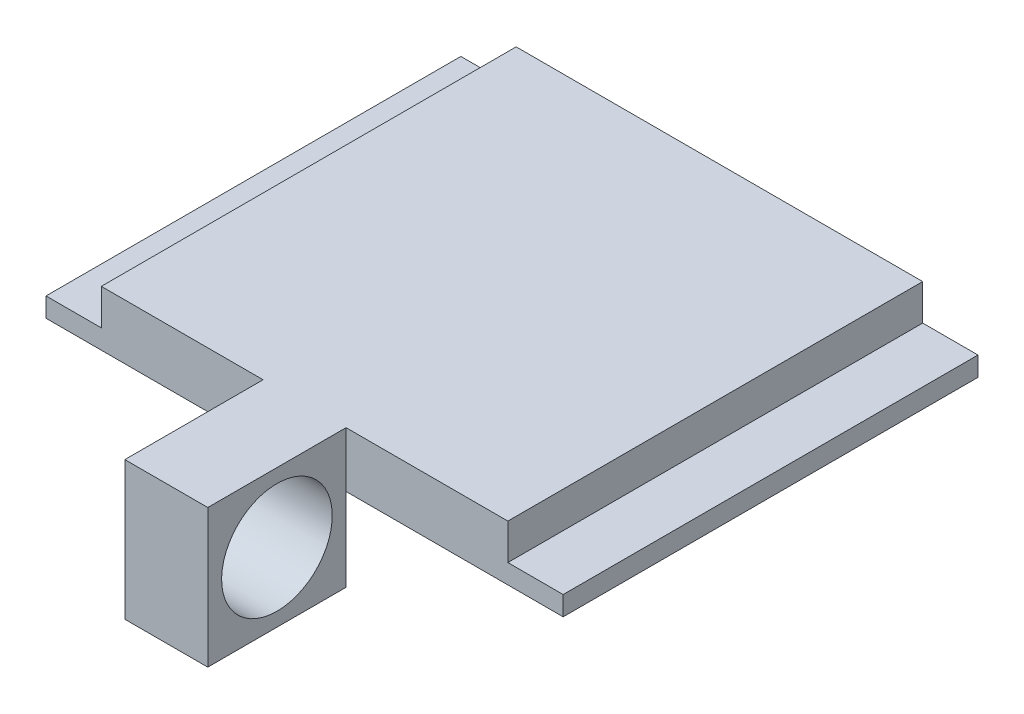
ISO-10303-21;
HEADER;
FILE_DESCRIPTION(('STEP AP214'),'2;1');
FILE_NAME('part.step','',(''),(''),'','','');
FILE_SCHEMA(('AUTOMOTIVE_DESIGN { 1 0 10303 214 1 1 1 1 }'));
ENDSEC;
DATA;
#1=APPLICATION_CONTEXT('core data for automotive mechanical design processes');
#2=APPLICATION_PROTOCOL_DEFINITION('international standard','automotive_design',2000,#1);
#3=PRODUCT_CONTEXT('',#1,'mechanical');
#4=PRODUCT('Part','Part','',(#3));
#5=PRODUCT_RELATED_PRODUCT_CATEGORY('part','',(#4));
#6=PRODUCT_DEFINITION_FORMATION('','',#4);
#7=PRODUCT_DEFINITION_CONTEXT('part definition',#1,'design');
#8=PRODUCT_DEFINITION('design','',#6,#7);
#9=PRODUCT_DEFINITION_SHAPE('','',#8);
#10=(LENGTH_UNIT() NAMED_UNIT(*) SI_UNIT(.MILLI.,.METRE.));
#11=(NAMED_UNIT(*) PLANE_ANGLE_UNIT() SI_UNIT($,.RADIAN.));
#12=(NAMED_UNIT(*) SI_UNIT($,.STERADIAN.) SOLID_ANGLE_UNIT());
#13=UNCERTAINTY_MEASURE_WITH_UNIT(LENGTH_MEASURE(1.E-05),#10,'distance_accuracy_value','');
#14=(GEOMETRIC_REPRESENTATION_CONTEXT(3) GLOBAL_UNCERTAINTY_ASSIGNED_CONTEXT((#13)) GLOBAL_UNIT_ASSIGNED_CONTEXT((#10,
#11,#12)) REPRESENTATION_CONTEXT('',''));
#15=CARTESIAN_POINT('',(0.,0.,0.));
#16=DIRECTION('',(0.,0.,1.));
#17=DIRECTION('',(1.,0.,0.));
#18=AXIS2_PLACEMENT_3D('',#15,#16,#17);
#19=CARTESIAN_POINT('',(0.,0.,0.));
#20=DIRECTION('',(0.,0.,-1.));
#21=DIRECTION('',(-1.,0.,0.));
#22=AXIS2_PLACEMENT_3D('',#19,#20,#21);
#23=PLANE('',#22);
#24=DIRECTION('',(0.,-1.,0.));
#25=VECTOR('',#24,1.);
#26=CARTESIAN_POINT('',(-1.5,0.,0.));
#27=LINE('',#26,#25);
#28=CARTESIAN_POINT('',(-1.5,0.65,0.));
#29=VERTEX_POINT('',#28);
#30=CARTESIAN_POINT('',(-1.5,-1.35,0.));
#31=VERTEX_POINT('',#30);
#32=EDGE_CURVE('E160',#29,#31,#27,.T.);
#33=ORIENTED_EDGE('',*,*,#32,.F.);
#34=DIRECTION('',(-1.,0.,0.));
#35=VECTOR('',#34,1.);
#36=CARTESIAN_POINT('',(-7.35,0.65,0.));
#37=LINE('',#36,#35);
#38=CARTESIAN_POINT('',(-7.35,0.65,0.));
#39=VERTEX_POINT('',#38);
#40=EDGE_CURVE('E171',#29,#39,#37,.T.);
#41=ORIENTED_EDGE('',*,*,#40,.T.);
#42=DIRECTION('',(0.,-1.,0.));
#43=VECTOR('',#42,1.);
#44=CARTESIAN_POINT('',(-7.35,-0.5,0.));
#45=LINE('',#44,#43);
#46=CARTESIAN_POINT('',(-7.35,-0.65,0.));
#47=VERTEX_POINT('',#46);
#48=EDGE_CURVE('E210',#39,#47,#45,.T.);
#49=ORIENTED_EDGE('',*,*,#48,.T.);
#50=DIRECTION('',(-1.,0.,0.));
#51=VECTOR('',#50,1.);
#52=CARTESIAN_POINT('',(-9.35,-0.65,0.));
#53=LINE('',#52,#51);
#54=CARTESIAN_POINT('',(-9.35,-0.65,0.));
#55=VERTEX_POINT('',#54);
#56=EDGE_CURVE('E214',#47,#55,#53,.T.);
#57=ORIENTED_EDGE('',*,*,#56,.T.);
#58=DIRECTION('',(0.,-1.,0.));
#59=VECTOR('',#58,1.);
#60=CARTESIAN_POINT('',(-9.35,-1.35,0.));
#61=LINE('',#60,#59);
#62=CARTESIAN_POINT('',(-9.35,-1.35,0.));
#63=VERTEX_POINT('',#62);
#64=EDGE_CURVE('E218',#55,#63,#61,.T.);
#65=ORIENTED_EDGE('',*,*,#64,.T.);
#66=DIRECTION('',(1.,0.,0.));
#67=VECTOR('',#66,1.);
#68=CARTESIAN_POINT('',(9.35,-1.35,0.));
#69=LINE('',#68,#67);
#70=EDGE_CURVE('E223',#63,#31,#69,.T.);
#71=ORIENTED_EDGE('',*,*,#70,.T.);
#72=EDGE_LOOP('',(#33,#41,#49,#57,#65,#71));
#73=FACE_BOUND('',#72,.T.);
#74=ADVANCED_FACE('F39',(#73),#23,.F.);
#75=DIRECTION('',(0.,1.,0.));
#76=VECTOR('',#75,1.);
#77=CARTESIAN_POINT('',(1.5,0.,0.));
#78=LINE('',#77,#76);
#79=CARTESIAN_POINT('',(1.5,-1.35,0.));
#80=VERTEX_POINT('',#79);
#81=CARTESIAN_POINT('',(1.5,0.65,0.));
#82=VERTEX_POINT('',#81);
#83=EDGE_CURVE('E11',#80,#82,#78,.T.);
#84=ORIENTED_EDGE('',*,*,#83,.F.);
#85=CARTESIAN_POINT('',(9.35,-1.35,0.));
#86=VERTEX_POINT('',#85);
#87=EDGE_CURVE('E222',#80,#86,#69,.T.);
#88=ORIENTED_EDGE('',*,*,#87,.T.);
#89=DIRECTION('',(0.,1.,0.));
#90=VECTOR('',#89,1.);
#91=CARTESIAN_POINT('',(9.35,-0.65,0.));
#92=LINE('',#91,#90);
#93=CARTESIAN_POINT('',(9.35,-0.65,0.));
#94=VERTEX_POINT('',#93);
#95=EDGE_CURVE('E226',#86,#94,#92,.T.);
#96=ORIENTED_EDGE('',*,*,#95,.T.);
#97=DIRECTION('',(-1.,0.,0.));
#98=VECTOR('',#97,1.);
#99=CARTESIAN_POINT('',(7.5,-0.65,0.));
#100=LINE('',#99,#98);
#101=CARTESIAN_POINT('',(7.35,-0.65,0.));
#102=VERTEX_POINT('',#101);
#103=EDGE_CURVE('E182',#94,#102,#100,.T.);
#104=ORIENTED_EDGE('',*,*,#103,.T.);
#105=DIRECTION('',(0.,1.,0.));
#106=VECTOR('',#105,1.);
#107=CARTESIAN_POINT('',(7.35,0.65,0.));
#108=LINE('',#107,#106);
#109=CARTESIAN_POINT('',(7.35,0.65,0.));
#110=VERTEX_POINT('',#109);
#111=EDGE_CURVE('E166',#102,#110,#108,.T.);
#112=ORIENTED_EDGE('',*,*,#111,.T.);
#113=EDGE_CURVE('E207',#110,#82,#37,.T.);
#114=ORIENTED_EDGE('',*,*,#113,.T.);
#115=EDGE_LOOP('',(#84,#88,#96,#104,#112,#114));
#116=FACE_BOUND('',#115,.T.);
#117=ADVANCED_FACE('F273',(#116),#23,.F.);
#118=CARTESIAN_POINT('',(7.5,-0.65,-15.));
#119=DIRECTION('',(0.,1.,0.));
#120=DIRECTION('',(0.,0.,1.));
#121=AXIS2_PLACEMENT_3D('',#118,#119,#120);
#122=PLANE('',#121);
#123=ORIENTED_EDGE('',*,*,#103,.F.);
#124=DIRECTION('',(0.,0.,1.));
#125=VECTOR('',#124,1.);
#126=CARTESIAN_POINT('',(9.35,-0.65,-15.));
#127=LINE('',#126,#125);
#128=CARTESIAN_POINT('',(9.35,-0.65,-15.));
#129=VERTEX_POINT('',#128);
#130=EDGE_CURVE('E49',#129,#94,#127,.T.);
#131=ORIENTED_EDGE('',*,*,#130,.F.);
#132=DIRECTION('',(-1.,0.,0.));
#133=VECTOR('',#132,1.);
#134=CARTESIAN_POINT('',(7.5,-0.65,-15.));
#135=LINE('',#134,#133);
#136=CARTESIAN_POINT('',(7.35,-0.65,-15.));
#137=VERTEX_POINT('',#136);
#138=EDGE_CURVE('E177',#129,#137,#135,.T.);
#139=ORIENTED_EDGE('',*,*,#138,.T.);
#140=DIRECTION('',(0.,0.,1.));
#141=VECTOR('',#140,1.);
#142=CARTESIAN_POINT('',(7.35,-0.65,-15.));
#143=LINE('',#142,#141);
#144=EDGE_CURVE('E43',#137,#102,#143,.T.);
#145=ORIENTED_EDGE('',*,*,#144,.T.);
#146=EDGE_LOOP('',(#123,#131,#139,#145));
#147=FACE_BOUND('',#146,.T.);
#148=ADVANCED_FACE('F261',(#147),#122,.T.);
#149=CARTESIAN_POINT('',(9.35,-0.65,-15.));
#150=DIRECTION('',(1.,0.,0.));
#151=DIRECTION('',(0.,0.,-1.));
#152=AXIS2_PLACEMENT_3D('',#149,#150,#151);
#153=PLANE('',#152);
#154=ORIENTED_EDGE('',*,*,#95,.F.);
#155=DIRECTION('',(0.,0.,1.));
#156=VECTOR('',#155,1.);
#157=CARTESIAN_POINT('',(9.35,-1.35,-15.));
#158=LINE('',#157,#156);
#159=CARTESIAN_POINT('',(9.35,-1.35,-15.));
#160=VERTEX_POINT('',#159);
#161=EDGE_CURVE('E235',#160,#86,#158,.T.);
#162=ORIENTED_EDGE('',*,*,#161,.F.);
#163=DIRECTION('',(0.,1.,0.));
#164=VECTOR('',#163,1.);
#165=CARTESIAN_POINT('',(9.35,-0.65,-15.));
#166=LINE('',#165,#164);
#167=EDGE_CURVE('E203',#160,#129,#166,.T.);
#168=ORIENTED_EDGE('',*,*,#167,.T.);
#169=ORIENTED_EDGE('',*,*,#130,.T.);
#170=EDGE_LOOP('',(#154,#162,#168,#169));
#171=FACE_BOUND('',#170,.T.);
#172=ADVANCED_FACE('F276',(#171),#153,.T.);
#173=CARTESIAN_POINT('',(9.35,-1.35,-15.));
#174=DIRECTION('',(0.,-1.,0.));
#175=DIRECTION('',(0.,0.,-1.));
#176=AXIS2_PLACEMENT_3D('',#173,#174,#175);
#177=PLANE('',#176);
#178=ORIENTED_EDGE('',*,*,#70,.F.);
#179=DIRECTION('',(0.,0.,1.));
#180=VECTOR('',#179,1.);
#181=CARTESIAN_POINT('',(-9.35,-1.35,-15.));
#182=LINE('',#181,#180);
#183=CARTESIAN_POINT('',(-9.35,-1.35,-15.));
#184=VERTEX_POINT('',#183);
#185=EDGE_CURVE('E239',#184,#63,#182,.T.);
#186=ORIENTED_EDGE('',*,*,#185,.F.);
#187=DIRECTION('',(1.,0.,0.));
#188=VECTOR('',#187,1.);
#189=CARTESIAN_POINT('',(9.35,-1.35,-15.));
#190=LINE('',#189,#188);
#191=EDGE_CURVE('E199',#184,#160,#190,.T.);
#192=ORIENTED_EDGE('',*,*,#191,.T.);
#193=ORIENTED_EDGE('',*,*,#161,.T.);
#194=ORIENTED_EDGE('',*,*,#87,.F.);
#195=EDGE_CURVE('E63',#31,#80,#69,.T.);
#196=ORIENTED_EDGE('',*,*,#195,.F.);
#197=EDGE_LOOP('',(#178,#186,#192,#193,#194,#196));
#198=FACE_BOUND('',#197,.T.);
#199=ADVANCED_FACE('F279',(#198),#177,.T.);
#200=CARTESIAN_POINT('',(-9.35,-1.35,-15.));
#201=DIRECTION('',(-1.,0.,0.));
#202=DIRECTION('',(0.,0.,1.));
#203=AXIS2_PLACEMENT_3D('',#200,#201,#202);
#204=PLANE('',#203);
#205=ORIENTED_EDGE('',*,*,#64,.F.);
#206=DIRECTION('',(0.,0.,1.));
#207=VECTOR('',#206,1.);
#208=CARTESIAN_POINT('',(-9.35,-0.65,-15.));
#209=LINE('',#208,#207);
#210=CARTESIAN_POINT('',(-9.35,-0.65,-15.));
#211=VERTEX_POINT('',#210);
#212=EDGE_CURVE('E242',#211,#55,#209,.T.);
#213=ORIENTED_EDGE('',*,*,#212,.F.);
#214=DIRECTION('',(0.,-1.,0.));
#215=VECTOR('',#214,1.);
#216=CARTESIAN_POINT('',(-9.35,-1.35,-15.));
#217=LINE('',#216,#215);
#218=EDGE_CURVE('E195',#211,#184,#217,.T.);
#219=ORIENTED_EDGE('',*,*,#218,.T.);
#220=ORIENTED_EDGE('',*,*,#185,.T.);
#221=EDGE_LOOP('',(#205,#213,#219,#220));
#222=FACE_BOUND('',#221,.T.);
#223=ADVANCED_FACE('F282',(#222),#204,.T.);
#224=CARTESIAN_POINT('',(-9.35,-0.65,-15.));
#225=DIRECTION('',(0.,1.,0.));
#226=DIRECTION('',(0.,0.,1.));
#227=AXIS2_PLACEMENT_3D('',#224,#225,#226);
#228=PLANE('',#227);
#229=ORIENTED_EDGE('',*,*,#56,.F.);
#230=DIRECTION('',(0.,0.,1.));
#231=VECTOR('',#230,1.);
#232=CARTESIAN_POINT('',(-7.35,-0.65,-15.));
#233=LINE('',#232,#231);
#234=CARTESIAN_POINT('',(-7.35,-0.65,-15.));
#235=VERTEX_POINT('',#234);
#236=EDGE_CURVE('E245',#235,#47,#233,.T.);
#237=ORIENTED_EDGE('',*,*,#236,.F.);
#238=DIRECTION('',(-1.,0.,0.));
#239=VECTOR('',#238,1.);
#240=CARTESIAN_POINT('',(-7.35,-0.65,-15.));
#241=LINE('',#240,#239);
#242=EDGE_CURVE('E192',#235,#211,#241,.T.);
#243=ORIENTED_EDGE('',*,*,#242,.T.);
#244=ORIENTED_EDGE('',*,*,#212,.T.);
#245=EDGE_LOOP('',(#229,#237,#243,#244));
#246=FACE_BOUND('',#245,.T.);
#247=ADVANCED_FACE('F286',(#246),#228,.T.);
#248=CARTESIAN_POINT('',(-7.35,-0.5,-15.));
#249=DIRECTION('',(-1.,0.,0.));
#250=DIRECTION('',(0.,0.,1.));
#251=AXIS2_PLACEMENT_3D('',#248,#249,#250);
#252=PLANE('',#251);
#253=ORIENTED_EDGE('',*,*,#48,.F.);
#254=DIRECTION('',(0.,0.,1.));
#255=VECTOR('',#254,1.);
#256=CARTESIAN_POINT('',(-7.35,0.65,-15.));
#257=LINE('',#256,#255);
#258=CARTESIAN_POINT('',(-7.35,0.65,-15.));
#259=VERTEX_POINT('',#258);
#260=EDGE_CURVE('E249',#259,#39,#257,.T.);
#261=ORIENTED_EDGE('',*,*,#260,.F.);
#262=DIRECTION('',(0.,-1.,0.));
#263=VECTOR('',#262,1.);
#264=CARTESIAN_POINT('',(-7.35,0.35,-15.));
#265=LINE('',#264,#263);
#266=EDGE_CURVE('E189',#259,#235,#265,.T.);
#267=ORIENTED_EDGE('',*,*,#266,.T.);
#268=ORIENTED_EDGE('',*,*,#236,.T.);
#269=EDGE_LOOP('',(#253,#261,#267,#268));
#270=FACE_BOUND('',#269,.T.);
#271=ADVANCED_FACE('F289',(#270),#252,.T.);
#272=CARTESIAN_POINT('',(-7.35,0.65,-15.));
#273=DIRECTION('',(0.,1.,0.));
#274=DIRECTION('',(0.,0.,1.));
#275=AXIS2_PLACEMENT_3D('',#272,#273,#274);
#276=PLANE('',#275);
#277=ORIENTED_EDGE('',*,*,#113,.F.);
#278=DIRECTION('',(0.,0.,1.));
#279=VECTOR('',#278,1.);
#280=CARTESIAN_POINT('',(7.35,0.65,-15.));
#281=LINE('',#280,#279);
#282=CARTESIAN_POINT('',(7.35,0.65,-15.));
#283=VERTEX_POINT('',#282);
#284=EDGE_CURVE('E252',#283,#110,#281,.T.);
#285=ORIENTED_EDGE('',*,*,#284,.F.);
#286=DIRECTION('',(-1.,0.,0.));
#287=VECTOR('',#286,1.);
#288=CARTESIAN_POINT('',(-7.35,0.65,-15.));
#289=LINE('',#288,#287);
#290=EDGE_CURVE('E185',#283,#259,#289,.T.);
#291=ORIENTED_EDGE('',*,*,#290,.T.);
#292=ORIENTED_EDGE('',*,*,#260,.T.);
#293=ORIENTED_EDGE('',*,*,#40,.F.);
#294=DIRECTION('',(0.,0.,-1.));
#295=VECTOR('',#294,1.);
#296=CARTESIAN_POINT('',(-1.5,0.65,5.));
#297=LINE('',#296,#295);
#298=CARTESIAN_POINT('',(-1.5,0.65,5.));
#299=VERTEX_POINT('',#298);
#300=EDGE_CURVE('E173',#299,#29,#297,.T.);
#301=ORIENTED_EDGE('',*,*,#300,.F.);
#302=DIRECTION('',(-1.,0.,0.));
#303=VECTOR('',#302,1.);
#304=CARTESIAN_POINT('',(0.,0.65,5.));
#305=LINE('',#304,#303);
#306=CARTESIAN_POINT('',(1.5,0.65,5.));
#307=VERTEX_POINT('',#306);
#308=EDGE_CURVE('E149',#307,#299,#305,.T.);
#309=ORIENTED_EDGE('',*,*,#308,.F.);
#310=DIRECTION('',(0.,0.,-1.));
#311=VECTOR('',#310,1.);
#312=CARTESIAN_POINT('',(1.5,0.65,5.));
#313=LINE('',#312,#311);
#314=EDGE_CURVE('E145',#307,#82,#313,.T.);
#315=ORIENTED_EDGE('',*,*,#314,.T.);
#316=EDGE_LOOP('',(#277,#285,#291,#292,#293,#301,#309,#315));
#317=FACE_BOUND('',#316,.T.);
#318=ADVANCED_FACE('F271',(#317),#276,.T.);
#319=CARTESIAN_POINT('',(7.35,0.65,-15.));
#320=DIRECTION('',(1.,0.,0.));
#321=DIRECTION('',(0.,0.,-1.));
#322=AXIS2_PLACEMENT_3D('',#319,#320,#321);
#323=PLANE('',#322);
#324=ORIENTED_EDGE('',*,*,#111,.F.);
#325=ORIENTED_EDGE('',*,*,#144,.F.);
#326=DIRECTION('',(0.,1.,0.));
#327=VECTOR('',#326,1.);
#328=CARTESIAN_POINT('',(7.35,-0.65,-15.));
#329=LINE('',#328,#327);
#330=EDGE_CURVE('E181',#137,#283,#329,.T.);
#331=ORIENTED_EDGE('',*,*,#330,.T.);
#332=ORIENTED_EDGE('',*,*,#284,.T.);
#333=EDGE_LOOP('',(#324,#325,#331,#332));
#334=FACE_BOUND('',#333,.T.);
#335=ADVANCED_FACE('F41',(#334),#323,.T.);
#336=CARTESIAN_POINT('',(0.,0.,-15.));
#337=DIRECTION('',(0.,0.,-1.));
#338=DIRECTION('',(-1.,0.,0.));
#339=AXIS2_PLACEMENT_3D('',#336,#337,#338);
#340=PLANE('',#339);
#341=ORIENTED_EDGE('',*,*,#138,.F.);
#342=ORIENTED_EDGE('',*,*,#167,.F.);
#343=ORIENTED_EDGE('',*,*,#191,.F.);
#344=ORIENTED_EDGE('',*,*,#218,.F.);
#345=ORIENTED_EDGE('',*,*,#242,.F.);
#346=ORIENTED_EDGE('',*,*,#266,.F.);
#347=ORIENTED_EDGE('',*,*,#290,.F.);
#348=ORIENTED_EDGE('',*,*,#330,.F.);
#349=EDGE_LOOP('',(#341,#342,#343,#344,#345,#346,#347,#348));
#350=FACE_BOUND('',#349,.T.);
#351=ADVANCED_FACE('F266',(#350),#340,.T.);
#352=CARTESIAN_POINT('',(0.,0.,0.));
#353=DIRECTION('',(0.,0.,1.));
#354=DIRECTION('',(1.,0.,0.));
#355=AXIS2_PLACEMENT_3D('',#352,#353,#354);
#356=PLANE('',#355);
#357=CARTESIAN_POINT('',(-1.5,-4.35,0.));
#358=VERTEX_POINT('',#357);
#359=EDGE_CURVE('E300',#31,#358,#27,.T.);
#360=ORIENTED_EDGE('',*,*,#359,.F.);
#361=ORIENTED_EDGE('',*,*,#195,.T.);
#362=CARTESIAN_POINT('',(1.5,-4.35,0.));
#363=VERTEX_POINT('',#362);
#364=EDGE_CURVE('E51',#363,#80,#78,.T.);
#365=ORIENTED_EDGE('',*,*,#364,.F.);
#366=DIRECTION('',(1.,0.,0.));
#367=VECTOR('',#366,1.);
#368=CARTESIAN_POINT('',(0.,-4.35,0.));
#369=LINE('',#368,#367);
#370=EDGE_CURVE('E164',#358,#363,#369,.T.);
#371=ORIENTED_EDGE('',*,*,#370,.F.);
#372=EDGE_LOOP('',(#360,#361,#365,#371));
#373=FACE_BOUND('',#372,.T.);
#374=ADVANCED_FACE('F299',(#373),#356,.F.);
#375=CARTESIAN_POINT('',(0.,-4.35,5.));
#376=DIRECTION('',(0.,1.,0.));
#377=DIRECTION('',(0.,0.,1.));
#378=AXIS2_PLACEMENT_3D('',#375,#376,#377);
#379=PLANE('',#378);
#380=ORIENTED_EDGE('',*,*,#370,.T.);
#381=DIRECTION('',(0.,0.,-1.));
#382=VECTOR('',#381,1.);
#383=CARTESIAN_POINT('',(1.5,-4.35,5.));
#384=LINE('',#383,#382);
#385=CARTESIAN_POINT('',(1.5,-4.35,5.));
#386=VERTEX_POINT('',#385);
#387=EDGE_CURVE('E142',#386,#363,#384,.T.);
#388=ORIENTED_EDGE('',*,*,#387,.F.);
#389=DIRECTION('',(1.,0.,0.));
#390=VECTOR('',#389,1.);
#391=CARTESIAN_POINT('',(0.,-4.35,5.));
#392=LINE('',#391,#390);
#393=CARTESIAN_POINT('',(-1.5,-4.35,5.));
#394=VERTEX_POINT('',#393);
#395=EDGE_CURVE('E150',#394,#386,#392,.T.);
#396=ORIENTED_EDGE('',*,*,#395,.F.);
#397=DIRECTION('',(0.,0.,-1.));
#398=VECTOR('',#397,1.);
#399=CARTESIAN_POINT('',(-1.5,-4.35,5.));
#400=LINE('',#399,#398);
#401=EDGE_CURVE('E310',#394,#358,#400,.T.);
#402=ORIENTED_EDGE('',*,*,#401,.T.);
#403=EDGE_LOOP('',(#380,#388,#396,#402));
#404=FACE_BOUND('',#403,.T.);
#405=ADVANCED_FACE('F162',(#404),#379,.F.);
#406=CARTESIAN_POINT('',(1.5,0.,5.));
#407=DIRECTION('',(-1.,0.,0.));
#408=DIRECTION('',(0.,-1.,0.));
#409=AXIS2_PLACEMENT_3D('',#406,#407,#408);
#410=PLANE('',#409);
#411=CARTESIAN_POINT('',(1.5,-1.85,2.5));
#412=DIRECTION('',(-1.,0.,0.));
#413=DIRECTION('',(0.,-1.,0.));
#414=AXIS2_PLACEMENT_3D('',#411,#412,#413);
#415=CIRCLE('',#414,2.);
#416=CARTESIAN_POINT('',(1.5,-3.85,2.5));
#417=VERTEX_POINT('',#416);
#418=EDGE_CURVE('E305',#417,#417,#415,.T.);
#419=ORIENTED_EDGE('',*,*,#418,.T.);
#420=EDGE_LOOP('',(#419));
#421=FACE_BOUND('',#420,.T.);
#422=ORIENTED_EDGE('',*,*,#364,.T.);
#423=ORIENTED_EDGE('',*,*,#83,.T.);
#424=ORIENTED_EDGE('',*,*,#314,.F.);
#425=DIRECTION('',(0.,1.,0.));
#426=VECTOR('',#425,1.);
#427=CARTESIAN_POINT('',(1.5,0.,5.));
#428=LINE('',#427,#426);
#429=EDGE_CURVE('E137',#386,#307,#428,.T.);
#430=ORIENTED_EDGE('',*,*,#429,.F.);
#431=ORIENTED_EDGE('',*,*,#387,.T.);
#432=EDGE_LOOP('',(#422,#423,#424,#430,#431));
#433=FACE_BOUND('',#432,.T.);
#434=ADVANCED_FACE('F140',(#421,#433),#410,.F.);
#435=CARTESIAN_POINT('',(-1.5,0.,5.));
#436=DIRECTION('',(1.,0.,0.));
#437=DIRECTION('',(0.,1.,0.));
#438=AXIS2_PLACEMENT_3D('',#435,#436,#437);
#439=PLANE('',#438);
#440=CARTESIAN_POINT('',(-1.5,-1.85,2.5));
#441=DIRECTION('',(-1.,0.,0.));
#442=DIRECTION('',(0.,-1.,0.));
#443=AXIS2_PLACEMENT_3D('',#440,#441,#442);
#444=CIRCLE('',#443,2.);
#445=CARTESIAN_POINT('',(-1.5,-3.85,2.5));
#446=VERTEX_POINT('',#445);
#447=EDGE_CURVE('E319',#446,#446,#444,.T.);
#448=ORIENTED_EDGE('',*,*,#447,.F.);
#449=EDGE_LOOP('',(#448));
#450=FACE_BOUND('',#449,.T.);
#451=ORIENTED_EDGE('',*,*,#32,.T.);
#452=ORIENTED_EDGE('',*,*,#359,.T.);
#453=ORIENTED_EDGE('',*,*,#401,.F.);
#454=DIRECTION('',(0.,-1.,0.));
#455=VECTOR('',#454,1.);
#456=CARTESIAN_POINT('',(-1.5,0.,5.));
#457=LINE('',#456,#455);
#458=EDGE_CURVE('E155',#299,#394,#457,.T.);
#459=ORIENTED_EDGE('',*,*,#458,.F.);
#460=ORIENTED_EDGE('',*,*,#300,.T.);
#461=EDGE_LOOP('',(#451,#452,#453,#459,#460));
#462=FACE_BOUND('',#461,.T.);
#463=ADVANCED_FACE('F314',(#450,#462),#439,.F.);
#464=CARTESIAN_POINT('',(0.,0.,5.));
#465=DIRECTION('',(0.,0.,1.));
#466=DIRECTION('',(1.,0.,0.));
#467=AXIS2_PLACEMENT_3D('',#464,#465,#466);
#468=PLANE('',#467);
#469=ORIENTED_EDGE('',*,*,#395,.T.);
#470=ORIENTED_EDGE('',*,*,#429,.T.);
#471=ORIENTED_EDGE('',*,*,#308,.T.);
#472=ORIENTED_EDGE('',*,*,#458,.T.);
#473=EDGE_LOOP('',(#469,#470,#471,#472));
#474=FACE_BOUND('',#473,.T.);
#475=ADVANCED_FACE('F153',(#474),#468,.T.);
#476=CARTESIAN_POINT('',(1.5,-1.85,2.5));
#477=DIRECTION('',(-1.,0.,0.));
#478=DIRECTION('',(0.,-1.,0.));
#479=AXIS2_PLACEMENT_3D('',#476,#477,#478);
#480=CYLINDRICAL_SURFACE('',#479,2.);
#481=ORIENTED_EDGE('',*,*,#418,.F.);
#482=EDGE_LOOP('',(#481));
#483=FACE_BOUND('',#482,.T.);
#484=ORIENTED_EDGE('',*,*,#447,.T.);
#485=EDGE_LOOP('',(#484));
#486=FACE_BOUND('',#485,.T.);
#487=ADVANCED_FACE('F328',(#483,#486),#480,.F.);
#488=CLOSED_SHELL('',(#74,#117,#148,#172,#199,#223,#247,#271,#318,#335,#351,#374,#405,#434,#463,
#475,#487));
#489=MANIFOLD_SOLID_BREP('B2',#488);
#490=ADVANCED_BREP_SHAPE_REPRESENTATION('',(#18,#489),#14);
#491=SHAPE_DEFINITION_REPRESENTATION(#9,#490);
ENDSEC;
END-ISO-10303-21;
